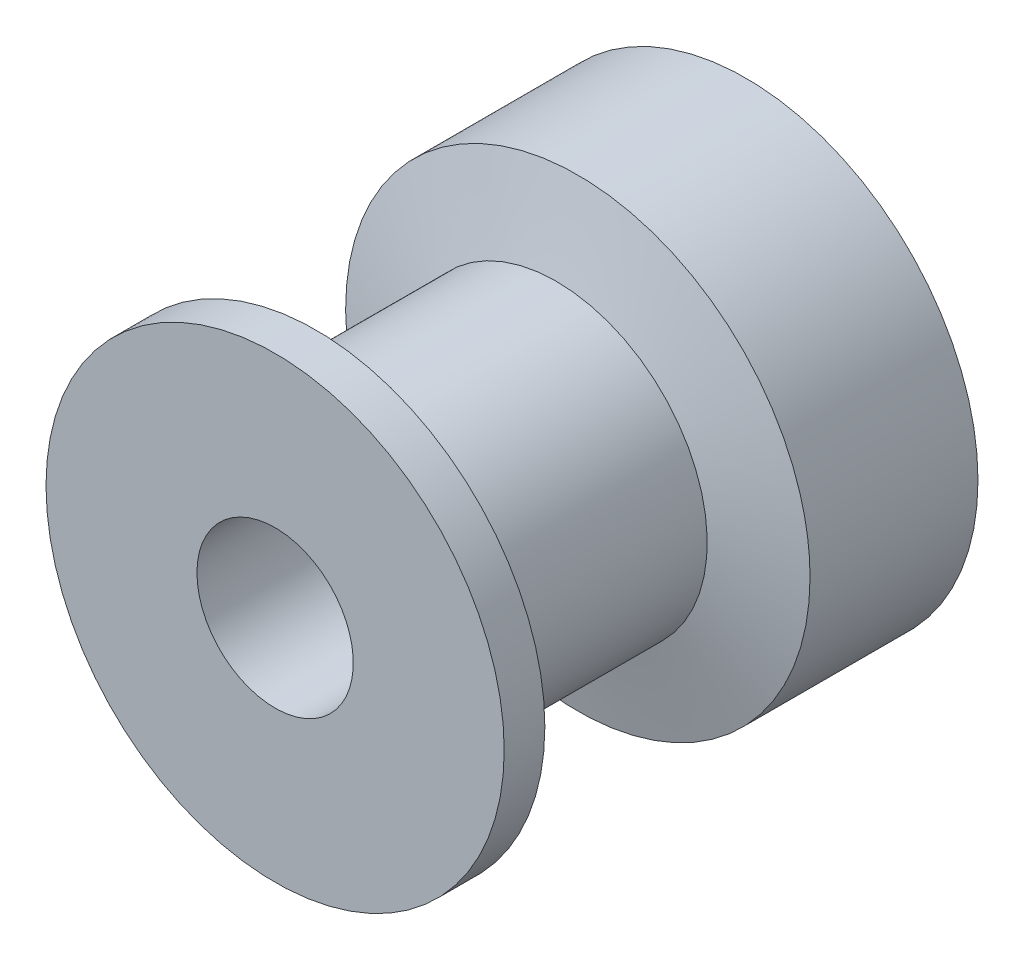
ISO-10303-21;
HEADER;
FILE_DESCRIPTION(('STEP AP214'),'2;1');
FILE_NAME('part.step','',(''),(''),'','','');
FILE_SCHEMA(('AUTOMOTIVE_DESIGN { 1 0 10303 214 1 1 1 1 }'));
ENDSEC;
DATA;
#1=APPLICATION_CONTEXT('core data for automotive mechanical design processes');
#2=APPLICATION_PROTOCOL_DEFINITION('international standard','automotive_design',2000,#1);
#3=PRODUCT_CONTEXT('',#1,'mechanical');
#4=PRODUCT('Part','Part','',(#3));
#5=PRODUCT_RELATED_PRODUCT_CATEGORY('part','',(#4));
#6=PRODUCT_DEFINITION_FORMATION('','',#4);
#7=PRODUCT_DEFINITION_CONTEXT('part definition',#1,'design');
#8=PRODUCT_DEFINITION('design','',#6,#7);
#9=PRODUCT_DEFINITION_SHAPE('','',#8);
#10=(LENGTH_UNIT() NAMED_UNIT(*) SI_UNIT(.MILLI.,.METRE.));
#11=(NAMED_UNIT(*) PLANE_ANGLE_UNIT() SI_UNIT($,.RADIAN.));
#12=(NAMED_UNIT(*) SI_UNIT($,.STERADIAN.) SOLID_ANGLE_UNIT());
#13=UNCERTAINTY_MEASURE_WITH_UNIT(LENGTH_MEASURE(1.E-05),#10,'distance_accuracy_value','');
#14=(GEOMETRIC_REPRESENTATION_CONTEXT(3) GLOBAL_UNCERTAINTY_ASSIGNED_CONTEXT((#13)) GLOBAL_UNIT_ASSIGNED_CONTEXT((#10,
#11,#12)) REPRESENTATION_CONTEXT('',''));
#15=CARTESIAN_POINT('',(0.,0.,0.));
#16=DIRECTION('',(0.,0.,1.));
#17=DIRECTION('',(1.,0.,0.));
#18=AXIS2_PLACEMENT_3D('',#15,#16,#17);
#19=CARTESIAN_POINT('',(0.,0.,-5.1435));
#20=DIRECTION('',(0.,0.,1.));
#21=DIRECTION('',(1.,0.,0.));
#22=AXIS2_PLACEMENT_3D('',#19,#20,#21);
#23=CYLINDRICAL_SURFACE('',#22,7.112);
#24=CARTESIAN_POINT('',(0.,0.,-5.1435));
#25=DIRECTION('',(0.,0.,1.));
#26=DIRECTION('',(1.,0.,0.));
#27=AXIS2_PLACEMENT_3D('',#24,#25,#26);
#28=CIRCLE('',#27,7.112);
#29=CARTESIAN_POINT('',(7.112,0.,-5.1435));
#30=VERTEX_POINT('',#29);
#31=EDGE_CURVE('E11',#30,#30,#28,.T.);
#32=ORIENTED_EDGE('',*,*,#31,.T.);
#33=EDGE_LOOP('',(#32));
#34=FACE_BOUND('',#33,.T.);
#35=CARTESIAN_POINT('',(0.,0.,0.));
#36=DIRECTION('',(0.,0.,1.));
#37=DIRECTION('',(1.,0.,0.));
#38=AXIS2_PLACEMENT_3D('',#35,#36,#37);
#39=CIRCLE('',#38,7.112);
#40=CARTESIAN_POINT('',(6.80543529213801,2.06557364538825,0.));
#41=VERTEX_POINT('',#40);
#42=EDGE_CURVE('E41',#41,#41,#39,.T.);
#43=ORIENTED_EDGE('',*,*,#42,.F.);
#44=EDGE_LOOP('',(#43));
#45=FACE_BOUND('',#44,.T.);
#46=ADVANCED_FACE('F34',(#34,#45),#23,.T.);
#47=CARTESIAN_POINT('',(0.,0.,-5.1435));
#48=DIRECTION('',(0.,0.,1.));
#49=DIRECTION('',(1.,0.,0.));
#50=AXIS2_PLACEMENT_3D('',#47,#48,#49);
#51=PLANE('',#50);
#52=CARTESIAN_POINT('',(0.,0.,-5.1435));
#53=DIRECTION('',(0.,0.,-1.));
#54=DIRECTION('',(-1.,0.,0.));
#55=AXIS2_PLACEMENT_3D('',#52,#53,#54);
#56=CIRCLE('',#55,2.39395);
#57=CARTESIAN_POINT('',(-2.39395,0.,-5.1435));
#58=VERTEX_POINT('',#57);
#59=EDGE_CURVE('E60',#58,#58,#56,.T.);
#60=ORIENTED_EDGE('',*,*,#59,.F.);
#61=EDGE_LOOP('',(#60));
#62=FACE_BOUND('',#61,.T.);
#63=ORIENTED_EDGE('',*,*,#31,.F.);
#64=EDGE_LOOP('',(#63));
#65=FACE_BOUND('',#64,.T.);
#66=ADVANCED_FACE('F75',(#62,#65),#51,.F.);
#67=CARTESIAN_POINT('',(6.80543529213801,2.06557364538825,0.));
#68=CARTESIAN_POINT('',(4.03550161704978,2.2549959066013,0.6604));
#69=CARTESIAN_POINT('',(2.67428800136151,15.6764442296643,0.));
#70=CARTESIAN_POINT('',(-0.474490196152826,10.3259991407009,0.6604));
#71=CARTESIAN_POINT('',(-10.9365825829145,11.5452969388878,0.));
#72=CARTESIAN_POINT('',(-8.54549343025238,5.81600732749825,0.6604));
#73=CARTESIAN_POINT('',(-6.80543529213801,-2.06557364538825,0.));
#74=CARTESIAN_POINT('',(-4.03550161704978,-2.2549959066013,0.6604));
#75=CARTESIAN_POINT('',(-2.67428800136151,-15.6764442296643,0.));
#76=CARTESIAN_POINT('',(0.474490196152822,-10.3259991407009,0.6604));
#77=CARTESIAN_POINT('',(10.9365825829145,-11.5452969388878,0.));
#78=CARTESIAN_POINT('',(8.54549343025238,-5.81600732749825,0.6604));
#79=CARTESIAN_POINT('',(6.80543529213801,2.06557364538825,0.));
#80=CARTESIAN_POINT('',(4.03550161704978,2.2549959066013,0.6604));
#81=(BOUNDED_SURFACE() B_SPLINE_SURFACE(3,1,((#67,#68),(#69,#70),(#71,#72),(#73,#74),(#75,#76),
(#77,#78),(#79,#80)),.UNSPECIFIED.,.T.,.F.,.F.) B_SPLINE_SURFACE_WITH_KNOTS((4,3,4),(2,2),(0.,
0.5,1.),(0.,1.),.UNSPECIFIED.) GEOMETRIC_REPRESENTATION_ITEM() RATIONAL_B_SPLINE_SURFACE(((1.,
1.),(0.333333333333333,0.333333333333333),(0.333333333333333,0.333333333333333),(1.,1.),
(0.333333333333333,0.333333333333334),(0.333333333333333,0.333333333333334),(1.,1.))) REPRESENTATION_ITEM('') SURFACE());
#82=CARTESIAN_POINT('',(0.,0.,0.6604));
#83=DIRECTION('',(0.,0.,1.));
#84=DIRECTION('',(1.,0.,0.));
#85=AXIS2_PLACEMENT_3D('',#82,#83,#84);
#86=CIRCLE('',#85,4.6228);
#87=CARTESIAN_POINT('',(4.03550161704978,2.2549959066013,0.6604));
#88=VERTEX_POINT('',#87);
#89=EDGE_CURVE('E46',#88,#88,#86,.T.);
#90=CARTESIAN_POINT('',(6.80543529213801,2.06557364538825,0.));
#91=CARTESIAN_POINT('',(6.77658181635584,2.06754679394255,0.00687916666666656));
#92=CARTESIAN_POINT('',(6.74772834057367,2.06951994249685,0.0137583333333333));
#93=CARTESIAN_POINT('',(6.69002138900933,2.07346623960546,0.0275166666666667));
#94=CARTESIAN_POINT('',(6.66116791322716,2.07543938815976,0.0343958333333334));
#95=CARTESIAN_POINT('',(6.60346096166282,2.07938568526837,0.0481541666666667));
#96=CARTESIAN_POINT('',(6.57460748588065,2.08135883382267,0.0550333333333334));
#97=CARTESIAN_POINT('',(6.51690053431632,2.08530513093127,0.0687916666666666));
#98=CARTESIAN_POINT('',(6.48804705853415,2.08727827948558,0.0756708333333333));
#99=CARTESIAN_POINT('',(6.43034010696981,2.09122457659418,0.0894291666666666));
#100=CARTESIAN_POINT('',(6.40148663118764,2.09319772514848,0.0963083333333333));
#101=CARTESIAN_POINT('',(6.3437796796233,2.09714402225709,0.110066666666667));
#102=CARTESIAN_POINT('',(6.31492620384113,2.09911717081139,0.116945833333333));
#103=CARTESIAN_POINT('',(6.25721925227679,2.10306346792,0.130704166666667));
#104=CARTESIAN_POINT('',(6.22836577649463,2.1050366164743,0.137583333333333));
#105=CARTESIAN_POINT('',(6.17065882493029,2.10898291358291,0.151341666666667));
#106=CARTESIAN_POINT('',(6.14180534914812,2.11095606213721,0.158220833333333));
#107=CARTESIAN_POINT('',(6.08409839758378,2.11490235924581,0.171979166666667));
#108=CARTESIAN_POINT('',(6.05524492180161,2.11687550780012,0.178858333333333));
#109=CARTESIAN_POINT('',(5.99753797023727,2.12082180490872,0.192616666666667));
#110=CARTESIAN_POINT('',(5.9686844944551,2.12279495346302,0.199495833333333));
#111=CARTESIAN_POINT('',(5.91097754289077,2.12674125057163,0.213254166666667));
#112=CARTESIAN_POINT('',(5.8821240671086,2.12871439912593,0.220133333333333));
#113=CARTESIAN_POINT('',(5.82441711554426,2.13266069623454,0.233891666666667));
#114=CARTESIAN_POINT('',(5.79556363976209,2.13463384478884,0.240770833333333));
#115=CARTESIAN_POINT('',(5.73785668819775,2.13858014189745,0.254529166666667));
#116=CARTESIAN_POINT('',(5.70900321241558,2.14055329045175,0.261408333333333));
#117=CARTESIAN_POINT('',(5.65129626085124,2.14449958756035,0.275166666666667));
#118=CARTESIAN_POINT('',(5.62244278506908,2.14647273611466,0.282045833333333));
#119=CARTESIAN_POINT('',(5.56473583350474,2.15041903322326,0.295804166666667));
#120=CARTESIAN_POINT('',(5.53588235772257,2.15239218177756,0.302683333333333));
#121=CARTESIAN_POINT('',(5.47817540615823,2.15633847888617,0.316441666666667));
#122=CARTESIAN_POINT('',(5.44932193037606,2.15831162744047,0.323320833333333));
#123=CARTESIAN_POINT('',(5.39161497881172,2.16225792454908,0.337079166666667));
#124=CARTESIAN_POINT('',(5.36276150302955,2.16423107310338,0.343958333333333));
#125=CARTESIAN_POINT('',(5.30505455146522,2.16817737021199,0.357716666666667));
#126=CARTESIAN_POINT('',(5.27620107568305,2.17015051876629,0.364595833333333));
#127=CARTESIAN_POINT('',(5.21849412411871,2.17409681587489,0.378354166666667));
#128=CARTESIAN_POINT('',(5.18964064833654,2.1760699644292,0.385233333333333));
#129=CARTESIAN_POINT('',(5.1319336967722,2.1800162615378,0.398991666666667));
#130=CARTESIAN_POINT('',(5.10308022099003,2.1819894100921,0.405870833333333));
#131=CARTESIAN_POINT('',(5.04537326942569,2.18593570720071,0.419629166666667));
#132=CARTESIAN_POINT('',(5.01651979364353,2.18790885575501,0.426508333333333));
#133=CARTESIAN_POINT('',(4.95881284207919,2.19185515286362,0.440266666666667));
#134=CARTESIAN_POINT('',(4.92995936629702,2.19382830141792,0.447145833333333));
#135=CARTESIAN_POINT('',(4.87225241473268,2.19777459852653,0.460904166666667));
#136=CARTESIAN_POINT('',(4.84339893895051,2.19974774708083,0.467783333333333));
#137=CARTESIAN_POINT('',(4.78569198738617,2.20369404418943,0.481541666666667));
#138=CARTESIAN_POINT('',(4.756838511604,2.20566719274374,0.488420833333333));
#139=CARTESIAN_POINT('',(4.69913156003967,2.20961348985234,0.502179166666667));
#140=CARTESIAN_POINT('',(4.6702780842575,2.21158663840664,0.509058333333333));
#141=CARTESIAN_POINT('',(4.61257113269316,2.21553293551525,0.522816666666667));
#142=CARTESIAN_POINT('',(4.58371765691099,2.21750608406955,0.529695833333333));
#143=CARTESIAN_POINT('',(4.52601070534665,2.22145238117816,0.543454166666667));
#144=CARTESIAN_POINT('',(4.49715722956448,2.22342552973246,0.550333333333333));
#145=CARTESIAN_POINT('',(4.43945027800014,2.22737182684107,0.564091666666667));
#146=CARTESIAN_POINT('',(4.41059680221798,2.22934497539537,0.570970833333333));
#147=CARTESIAN_POINT('',(4.35288985065364,2.23329127250397,0.584729166666667));
#148=CARTESIAN_POINT('',(4.32403637487147,2.23526442105828,0.591608333333333));
#149=CARTESIAN_POINT('',(4.26632942330713,2.23921071816688,0.605366666666667));
#150=CARTESIAN_POINT('',(4.23747594752496,2.24118386672118,0.612245833333333));
#151=CARTESIAN_POINT('',(4.17976899596062,2.24513016382979,0.626004166666667));
#152=CARTESIAN_POINT('',(4.15091552017845,2.24710331238409,0.632883333333333));
#153=CARTESIAN_POINT('',(4.09320856861412,2.2510496094927,0.646641666666667));
#154=CARTESIAN_POINT('',(4.06435509283195,2.253022758047,0.653520833333333));
#155=CARTESIAN_POINT('',(4.03550161704978,2.2549959066013,0.6604));
#156=B_SPLINE_CURVE_WITH_KNOTS('',3,(#90,#91,#92,#93,#94,#95,#96,#97,#98,#99,#100,#101,#102,
#103,#104,#105,#106,#107,#108,#109,#110,#111,#112,#113,#114,#115,#116,#117,#118,#119,#120,#121,
#122,#123,#124,#125,#126,#127,#128,#129,#130,#131,#132,#133,#134,#135,#136,#137,#138,#139,#140,
#141,#142,#143,#144,#145,#146,#147,#148,#149,#150,#151,#152,#153,#154,#155),.UNSPECIFIED.,.F.,
.F.,(4,2,2,2,2,2,2,2,2,2,2,2,2,2,2,2,2,2,2,2,2,2,2,2,2,2,2,2,2,2,2,2,4),(0.,0.0891832597835273,
0.178366519567054,0.267549779350581,0.356733039134108,0.445916298917635,0.535099558701162,
0.624282818484689,0.713466078268216,0.802649338051743,0.89183259783527,0.981015857618796,
1.07019911740232,1.15938237718585,1.24856563696938,1.3377488967529,1.42693215653643,
1.51611541631996,1.60529867610349,1.69448193588701,1.78366519567054,1.87284845545407,
1.96203171523759,2.05121497502112,2.14039823480465,2.22958149458817,2.3187647543717,
2.40794801415523,2.49713127393875,2.58631453372228,2.67549779350581,2.76468105328933,
2.85386431307286),.UNSPECIFIED.);
#157=EDGE_CURVE('BSEAM78',#41,#88,#156,.T.);
#158=ORIENTED_EDGE('',*,*,#42,.T.);
#159=ORIENTED_EDGE('',*,*,#89,.F.);
#160=ORIENTED_EDGE('',*,*,#157,.T.);
#161=ORIENTED_EDGE('',*,*,#157,.F.);
#162=EDGE_LOOP('',(#158,#160,#159,#161));
#163=FACE_BOUND('',#162,.T.);
#164=ADVANCED_FACE('F78',(#163),#81,.T.);
#165=CARTESIAN_POINT('',(0.,0.,8.0264));
#166=DIRECTION('',(0.,0.,-1.));
#167=DIRECTION('',(-1.,0.,0.));
#168=AXIS2_PLACEMENT_3D('',#165,#166,#167);
#169=CYLINDRICAL_SURFACE('',#168,4.6228);
#170=CARTESIAN_POINT('',(0.,0.,8.0264));
#171=DIRECTION('',(0.,0.,1.));
#172=DIRECTION('',(1.,0.,0.));
#173=AXIS2_PLACEMENT_3D('',#170,#171,#172);
#174=CIRCLE('',#173,4.6228);
#175=CARTESIAN_POINT('',(4.6228,0.,8.0264));
#176=VERTEX_POINT('',#175);
#177=EDGE_CURVE('E50',#176,#176,#174,.T.);
#178=ORIENTED_EDGE('',*,*,#177,.F.);
#179=EDGE_LOOP('',(#178));
#180=FACE_BOUND('',#179,.T.);
#181=ORIENTED_EDGE('',*,*,#89,.T.);
#182=EDGE_LOOP('',(#181));
#183=FACE_BOUND('',#182,.T.);
#184=ADVANCED_FACE('F83',(#180,#183),#169,.T.);
#185=CARTESIAN_POINT('',(0.,0.,8.0264));
#186=DIRECTION('',(0.,0.,1.));
#187=DIRECTION('',(1.,0.,0.));
#188=AXIS2_PLACEMENT_3D('',#185,#186,#187);
#189=PLANE('',#188);
#190=CARTESIAN_POINT('',(0.,0.,8.0264));
#191=DIRECTION('',(0.,0.,1.));
#192=DIRECTION('',(1.,0.,0.));
#193=AXIS2_PLACEMENT_3D('',#190,#191,#192);
#194=CIRCLE('',#193,7.01675);
#195=CARTESIAN_POINT('',(7.01675,0.,8.0264));
#196=VERTEX_POINT('',#195);
#197=EDGE_CURVE('E54',#196,#196,#194,.T.);
#198=ORIENTED_EDGE('',*,*,#197,.F.);
#199=EDGE_LOOP('',(#198));
#200=FACE_BOUND('',#199,.T.);
#201=ORIENTED_EDGE('',*,*,#177,.T.);
#202=EDGE_LOOP('',(#201));
#203=FACE_BOUND('',#202,.T.);
#204=ADVANCED_FACE('F96',(#200,#203),#189,.F.);
#205=CARTESIAN_POINT('',(0.,0.,9.271));
#206=DIRECTION('',(0.,0.,-1.));
#207=DIRECTION('',(-1.,0.,0.));
#208=AXIS2_PLACEMENT_3D('',#205,#206,#207);
#209=CYLINDRICAL_SURFACE('',#208,7.01675);
#210=CARTESIAN_POINT('',(0.,0.,9.271));
#211=DIRECTION('',(0.,0.,1.));
#212=DIRECTION('',(1.,0.,0.));
#213=AXIS2_PLACEMENT_3D('',#210,#211,#212);
#214=CIRCLE('',#213,7.01675);
#215=CARTESIAN_POINT('',(7.01675,0.,9.271));
#216=VERTEX_POINT('',#215);
#217=EDGE_CURVE('E53',#216,#216,#214,.T.);
#218=ORIENTED_EDGE('',*,*,#217,.F.);
#219=EDGE_LOOP('',(#218));
#220=FACE_BOUND('',#219,.T.);
#221=ORIENTED_EDGE('',*,*,#197,.T.);
#222=EDGE_LOOP('',(#221));
#223=FACE_BOUND('',#222,.T.);
#224=ADVANCED_FACE('F98',(#220,#223),#209,.T.);
#225=CARTESIAN_POINT('',(0.,0.,9.271));
#226=DIRECTION('',(0.,0.,1.));
#227=DIRECTION('',(1.,0.,0.));
#228=AXIS2_PLACEMENT_3D('',#225,#226,#227);
#229=PLANE('',#228);
#230=CARTESIAN_POINT('',(0.,0.,9.271));
#231=DIRECTION('',(0.,0.,-1.));
#232=DIRECTION('',(-1.,0.,0.));
#233=AXIS2_PLACEMENT_3D('',#230,#231,#232);
#234=CIRCLE('',#233,2.39395);
#235=CARTESIAN_POINT('',(-2.39395,0.,9.271));
#236=VERTEX_POINT('',#235);
#237=EDGE_CURVE('E57',#236,#236,#234,.T.);
#238=ORIENTED_EDGE('',*,*,#237,.T.);
#239=EDGE_LOOP('',(#238));
#240=FACE_BOUND('',#239,.T.);
#241=ORIENTED_EDGE('',*,*,#217,.T.);
#242=EDGE_LOOP('',(#241));
#243=FACE_BOUND('',#242,.T.);
#244=ADVANCED_FACE('F66',(#240,#243),#229,.T.);
#245=CARTESIAN_POINT('',(0.,0.,9.271));
#246=DIRECTION('',(0.,0.,-1.));
#247=DIRECTION('',(-1.,0.,0.));
#248=AXIS2_PLACEMENT_3D('',#245,#246,#247);
#249=CYLINDRICAL_SURFACE('',#248,2.39395);
#250=CARTESIAN_POINT('',(-2.39395,0.,9.271));
#251=CARTESIAN_POINT('',(-2.39395,0.,9.12084895833333));
#252=CARTESIAN_POINT('',(-2.39395,0.,8.97069791666667));
#253=CARTESIAN_POINT('',(-2.39395,0.,8.67039583333333));
#254=CARTESIAN_POINT('',(-2.39395,0.,8.52024479166667));
#255=CARTESIAN_POINT('',(-2.39395,0.,8.21994270833333));
#256=CARTESIAN_POINT('',(-2.39395,0.,8.06979166666667));
#257=CARTESIAN_POINT('',(-2.39395,0.,7.76948958333333));
#258=CARTESIAN_POINT('',(-2.39395,0.,7.61933854166667));
#259=CARTESIAN_POINT('',(-2.39395,0.,7.31903645833333));
#260=CARTESIAN_POINT('',(-2.39395,0.,7.16888541666667));
#261=CARTESIAN_POINT('',(-2.39395,0.,6.86858333333333));
#262=CARTESIAN_POINT('',(-2.39395,0.,6.71843229166667));
#263=CARTESIAN_POINT('',(-2.39395,0.,6.41813020833333));
#264=CARTESIAN_POINT('',(-2.39395,0.,6.26797916666667));
#265=CARTESIAN_POINT('',(-2.39395,0.,5.96767708333333));
#266=CARTESIAN_POINT('',(-2.39395,0.,5.81752604166667));
#267=CARTESIAN_POINT('',(-2.39395,0.,5.51722395833333));
#268=CARTESIAN_POINT('',(-2.39395,0.,5.36707291666667));
#269=CARTESIAN_POINT('',(-2.39395,0.,5.06677083333333));
#270=CARTESIAN_POINT('',(-2.39395,0.,4.91661979166667));
#271=CARTESIAN_POINT('',(-2.39395,0.,4.61631770833333));
#272=CARTESIAN_POINT('',(-2.39395,0.,4.46616666666667));
#273=CARTESIAN_POINT('',(-2.39395,0.,4.16586458333333));
#274=CARTESIAN_POINT('',(-2.39395,0.,4.01571354166667));
#275=CARTESIAN_POINT('',(-2.39395,0.,3.71541145833333));
#276=CARTESIAN_POINT('',(-2.39395,0.,3.56526041666667));
#277=CARTESIAN_POINT('',(-2.39395,0.,3.26495833333333));
#278=CARTESIAN_POINT('',(-2.39395,0.,3.11480729166667));
#279=CARTESIAN_POINT('',(-2.39395,0.,2.81450520833333));
#280=CARTESIAN_POINT('',(-2.39395,0.,2.66435416666667));
#281=CARTESIAN_POINT('',(-2.39395,0.,2.36405208333333));
#282=CARTESIAN_POINT('',(-2.39395,0.,2.21390104166667));
#283=CARTESIAN_POINT('',(-2.39395,0.,1.91359895833333));
#284=CARTESIAN_POINT('',(-2.39395,0.,1.76344791666667));
#285=CARTESIAN_POINT('',(-2.39395,0.,1.46314583333333));
#286=CARTESIAN_POINT('',(-2.39395,0.,1.31299479166667));
#287=CARTESIAN_POINT('',(-2.39395,0.,1.01269270833333));
#288=CARTESIAN_POINT('',(-2.39395,0.,0.862541666666668));
#289=CARTESIAN_POINT('',(-2.39395,0.,0.562239583333335));
#290=CARTESIAN_POINT('',(-2.39395,0.,0.412088541666668));
#291=CARTESIAN_POINT('',(-2.39395,0.,0.111786458333335));
#292=CARTESIAN_POINT('',(-2.39395,0.,-0.0383645833333315));
#293=CARTESIAN_POINT('',(-2.39395,0.,-0.338666666666665));
#294=CARTESIAN_POINT('',(-2.39395,0.,-0.488817708333331));
#295=CARTESIAN_POINT('',(-2.39395,0.,-0.789119791666665));
#296=CARTESIAN_POINT('',(-2.39395,0.,-0.939270833333331));
#297=CARTESIAN_POINT('',(-2.39395,0.,-1.23957291666666));
#298=CARTESIAN_POINT('',(-2.39395,0.,-1.38972395833333));
#299=CARTESIAN_POINT('',(-2.39395,0.,-1.69002604166666));
#300=CARTESIAN_POINT('',(-2.39395,0.,-1.84017708333333));
#301=CARTESIAN_POINT('',(-2.39395,0.,-2.14047916666666));
#302=CARTESIAN_POINT('',(-2.39395,0.,-2.29063020833333));
#303=CARTESIAN_POINT('',(-2.39395,0.,-2.59093229166667));
#304=CARTESIAN_POINT('',(-2.39395,0.,-2.74108333333333));
#305=CARTESIAN_POINT('',(-2.39395,0.,-3.04138541666667));
#306=CARTESIAN_POINT('',(-2.39395,0.,-3.19153645833333));
#307=CARTESIAN_POINT('',(-2.39395,0.,-3.49183854166667));
#308=CARTESIAN_POINT('',(-2.39395,0.,-3.64198958333333));
#309=CARTESIAN_POINT('',(-2.39395,0.,-3.94229166666667));
#310=CARTESIAN_POINT('',(-2.39395,0.,-4.09244270833333));
#311=CARTESIAN_POINT('',(-2.39395,0.,-4.39274479166667));
#312=CARTESIAN_POINT('',(-2.39395,0.,-4.54289583333333));
#313=CARTESIAN_POINT('',(-2.39395,0.,-4.84319791666667));
#314=CARTESIAN_POINT('',(-2.39395,0.,-4.99334895833333));
#315=CARTESIAN_POINT('',(-2.39395,0.,-5.1435));
#316=B_SPLINE_CURVE_WITH_KNOTS('',3,(#250,#251,#252,#253,#254,#255,#256,#257,#258,#259,#260,
#261,#262,#263,#264,#265,#266,#267,#268,#269,#270,#271,#272,#273,#274,#275,#276,#277,#278,#279,
#280,#281,#282,#283,#284,#285,#286,#287,#288,#289,#290,#291,#292,#293,#294,#295,#296,#297,#298,
#299,#300,#301,#302,#303,#304,#305,#306,#307,#308,#309,#310,#311,#312,#313,#314,#315),
.UNSPECIFIED.,.F.,.F.,(4,2,2,2,2,2,2,2,2,2,2,2,2,2,2,2,2,2,2,2,2,2,2,2,2,2,2,2,2,2,2,2,4),(0.,
0.450453125000002,0.900906250000002,1.351359375,1.8018125,2.252265625,2.70271875,3.153171875,
3.603625,4.054078125,4.50453125,4.954984375,5.4054375,5.855890625,6.30634375,6.756796875,
7.20725,7.657703125,8.10815625,8.558609375,9.0090625,9.459515625,9.90996875,10.360421875,
10.810875,11.261328125,11.71178125,12.162234375,12.6126875,13.063140625,13.51359375,
13.964046875,14.4145),.UNSPECIFIED.);
#317=EDGE_CURVE('BSEAM69',#236,#58,#316,.T.);
#318=ORIENTED_EDGE('',*,*,#237,.F.);
#319=ORIENTED_EDGE('',*,*,#59,.T.);
#320=ORIENTED_EDGE('',*,*,#317,.T.);
#321=ORIENTED_EDGE('',*,*,#317,.F.);
#322=EDGE_LOOP('',(#318,#320,#319,#321));
#323=FACE_BOUND('',#322,.T.);
#324=ADVANCED_FACE('F69',(#323),#249,.F.);
#325=CLOSED_SHELL('',(#46,#66,#164,#184,#204,#224,#244,#324));
#326=MANIFOLD_SOLID_BREP('B2',#325);
#327=ADVANCED_BREP_SHAPE_REPRESENTATION('',(#18,#326),#14);
#328=SHAPE_DEFINITION_REPRESENTATION(#9,#327);
ENDSEC;
END-ISO-10303-21;
